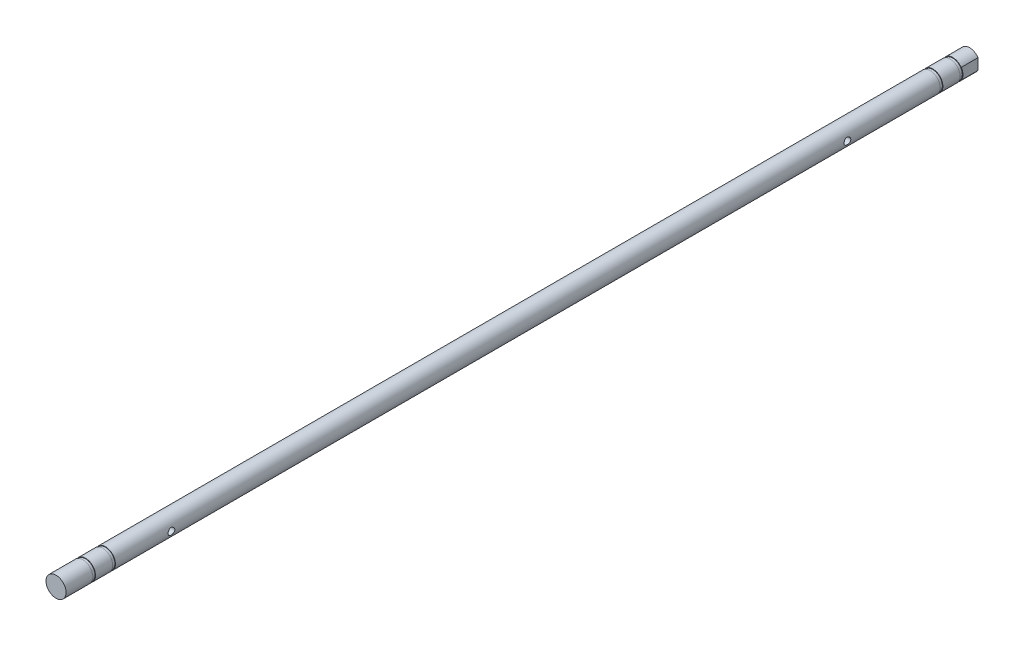
ISO-10303-21;
HEADER;
FILE_DESCRIPTION(('STEP AP214'),'2;1');
FILE_NAME('part.step','',(''),(''),'','','');
FILE_SCHEMA(('AUTOMOTIVE_DESIGN { 1 0 10303 214 1 1 1 1 }'));
ENDSEC;
DATA;
#1=APPLICATION_CONTEXT('core data for automotive mechanical design processes');
#2=APPLICATION_PROTOCOL_DEFINITION('international standard','automotive_design',2000,#1);
#3=PRODUCT_CONTEXT('',#1,'mechanical');
#4=PRODUCT('Part','Part','',(#3));
#5=PRODUCT_RELATED_PRODUCT_CATEGORY('part','',(#4));
#6=PRODUCT_DEFINITION_FORMATION('','',#4);
#7=PRODUCT_DEFINITION_CONTEXT('part definition',#1,'design');
#8=PRODUCT_DEFINITION('design','',#6,#7);
#9=PRODUCT_DEFINITION_SHAPE('','',#8);
#10=(LENGTH_UNIT() NAMED_UNIT(*) SI_UNIT(.MILLI.,.METRE.));
#11=(NAMED_UNIT(*) PLANE_ANGLE_UNIT() SI_UNIT($,.RADIAN.));
#12=(NAMED_UNIT(*) SI_UNIT($,.STERADIAN.) SOLID_ANGLE_UNIT());
#13=UNCERTAINTY_MEASURE_WITH_UNIT(LENGTH_MEASURE(1.E-05),#10,'distance_accuracy_value','');
#14=(GEOMETRIC_REPRESENTATION_CONTEXT(3) GLOBAL_UNCERTAINTY_ASSIGNED_CONTEXT((#13)) GLOBAL_UNIT_ASSIGNED_CONTEXT((#10,
#11,#12)) REPRESENTATION_CONTEXT('',''));
#15=CARTESIAN_POINT('',(0.,0.,0.));
#16=DIRECTION('',(0.,0.,1.));
#17=DIRECTION('',(1.,0.,0.));
#18=AXIS2_PLACEMENT_3D('',#15,#16,#17);
#19=CARTESIAN_POINT('',(-2.5,-3.00000000000001,0.));
#20=DIRECTION('',(1.,0.,0.));
#21=DIRECTION('',(0.,0.,-1.));
#22=AXIS2_PLACEMENT_3D('',#19,#20,#21);
#23=PLANE('',#22);
#24=DIRECTION('',(0.,1.,0.));
#25=VECTOR('',#24,1.);
#26=CARTESIAN_POINT('',(-2.5,-3.00000000000001,2.));
#27=LINE('',#26,#25);
#28=CARTESIAN_POINT('',(-2.49999999999998,-1.65831239517773,2.));
#29=VERTEX_POINT('',#28);
#30=CARTESIAN_POINT('',(-2.5,1.65831239517775,2.));
#31=VERTEX_POINT('',#30);
#32=EDGE_CURVE('E83',#29,#31,#27,.T.);
#33=ORIENTED_EDGE('',*,*,#32,.F.);
#34=DIRECTION('',(0.,0.,-1.));
#35=VECTOR('',#34,1.);
#36=CARTESIAN_POINT('',(-2.49999999999996,-1.65831239517775,275.));
#37=LINE('',#36,#35);
#38=CARTESIAN_POINT('',(-2.5,-1.6583123951777,7.00000000000001));
#39=VERTEX_POINT('',#38);
#40=EDGE_CURVE('E91',#39,#29,#37,.T.);
#41=ORIENTED_EDGE('',*,*,#40,.F.);
#42=DIRECTION('',(0.,1.,0.));
#43=VECTOR('',#42,1.);
#44=CARTESIAN_POINT('',(-2.5,-3.00000000000001,7.));
#45=LINE('',#44,#43);
#46=CARTESIAN_POINT('',(-2.5,1.6583123951777,7.00000000000001));
#47=VERTEX_POINT('',#46);
#48=EDGE_CURVE('E238',#39,#47,#45,.T.);
#49=ORIENTED_EDGE('',*,*,#48,.T.);
#50=DIRECTION('',(0.,0.,-1.));
#51=VECTOR('',#50,1.);
#52=CARTESIAN_POINT('',(-2.49999999999996,1.65831239517775,275.));
#53=LINE('',#52,#51);
#54=EDGE_CURVE('E100',#31,#47,#53,.F.);
#55=ORIENTED_EDGE('',*,*,#54,.F.);
#56=EDGE_LOOP('',(#33,#41,#49,#55));
#57=FACE_BOUND('',#56,.T.);
#58=ADVANCED_FACE('F42',(#57),#23,.F.);
#59=CARTESIAN_POINT('',(2.5,-3.00000000000001,0.));
#60=DIRECTION('',(-1.,0.,0.));
#61=DIRECTION('',(0.,0.,1.));
#62=AXIS2_PLACEMENT_3D('',#59,#60,#61);
#63=PLANE('',#62);
#64=DIRECTION('',(0.,-1.,0.));
#65=VECTOR('',#64,1.);
#66=CARTESIAN_POINT('',(2.5,-3.00000000000001,2.));
#67=LINE('',#66,#65);
#68=CARTESIAN_POINT('',(2.5,1.6583123951777,2.));
#69=VERTEX_POINT('',#68);
#70=CARTESIAN_POINT('',(2.50000000000003,-1.65831239517765,2.));
#71=VERTEX_POINT('',#70);
#72=EDGE_CURVE('E56',#69,#71,#67,.T.);
#73=ORIENTED_EDGE('',*,*,#72,.F.);
#74=DIRECTION('',(0.,0.,-1.));
#75=VECTOR('',#74,1.);
#76=CARTESIAN_POINT('',(2.50000000000003,1.65831239517765,275.));
#77=LINE('',#76,#75);
#78=CARTESIAN_POINT('',(2.5,1.6583123951777,7.00000000000001));
#79=VERTEX_POINT('',#78);
#80=EDGE_CURVE('E115',#79,#69,#77,.T.);
#81=ORIENTED_EDGE('',*,*,#80,.F.);
#82=DIRECTION('',(0.,1.,0.));
#83=VECTOR('',#82,1.);
#84=CARTESIAN_POINT('',(2.5,-3.00000000000001,7.));
#85=LINE('',#84,#83);
#86=CARTESIAN_POINT('',(2.5,-1.6583123951777,7.00000000000001));
#87=VERTEX_POINT('',#86);
#88=EDGE_CURVE('E67',#87,#79,#85,.T.);
#89=ORIENTED_EDGE('',*,*,#88,.F.);
#90=DIRECTION('',(0.,0.,-1.));
#91=VECTOR('',#90,1.);
#92=CARTESIAN_POINT('',(2.50000000000003,-1.65831239517765,275.));
#93=LINE('',#92,#91);
#94=EDGE_CURVE('E108',#71,#87,#93,.F.);
#95=ORIENTED_EDGE('',*,*,#94,.F.);
#96=EDGE_LOOP('',(#73,#81,#89,#95));
#97=FACE_BOUND('',#96,.T.);
#98=ADVANCED_FACE('F161',(#97),#63,.F.);
#99=CARTESIAN_POINT('',(0.,0.,275.));
#100=DIRECTION('',(0.,0.,-1.));
#101=DIRECTION('',(-1.,0.,0.));
#102=AXIS2_PLACEMENT_3D('',#99,#100,#101);
#103=CYLINDRICAL_SURFACE('',#102,3.);
#104=CARTESIAN_POINT('',(0.,0.,7.05000000000006));
#105=DIRECTION('',(0.,0.,1.));
#106=DIRECTION('',(1.,0.,0.));
#107=AXIS2_PLACEMENT_3D('',#104,#105,#106);
#108=CIRCLE('',#107,3.00000000000001);
#109=CARTESIAN_POINT('',(3.00000000000001,0.,7.05000000000006));
#110=VERTEX_POINT('',#109);
#111=EDGE_CURVE('E217',#110,#110,#108,.T.);
#112=ORIENTED_EDGE('',*,*,#111,.F.);
#113=EDGE_LOOP('',(#112));
#114=FACE_BOUND('',#113,.T.);
#115=CARTESIAN_POINT('',(0.,0.,2.));
#116=DIRECTION('',(0.,0.,-1.));
#117=DIRECTION('',(-1.,0.,0.));
#118=AXIS2_PLACEMENT_3D('',#115,#116,#117);
#119=CIRCLE('',#118,3.);
#120=EDGE_CURVE('E12',#31,#69,#119,.T.);
#121=ORIENTED_EDGE('',*,*,#120,.F.);
#122=ORIENTED_EDGE('',*,*,#54,.T.);
#123=CARTESIAN_POINT('',(0.,0.,7.00000000000001));
#124=DIRECTION('',(0.,0.,1.));
#125=DIRECTION('',(1.,0.,0.));
#126=AXIS2_PLACEMENT_3D('',#123,#124,#125);
#127=CIRCLE('',#126,3.);
#128=EDGE_CURVE('E105',#47,#39,#127,.T.);
#129=ORIENTED_EDGE('',*,*,#128,.T.);
#130=ORIENTED_EDGE('',*,*,#40,.T.);
#131=EDGE_CURVE('E47',#71,#29,#119,.T.);
#132=ORIENTED_EDGE('',*,*,#131,.F.);
#133=ORIENTED_EDGE('',*,*,#94,.T.);
#134=CARTESIAN_POINT('',(0.,0.,7.00000000000001));
#135=DIRECTION('',(0.,0.,1.));
#136=DIRECTION('',(1.,0.,0.));
#137=AXIS2_PLACEMENT_3D('',#134,#135,#136);
#138=CIRCLE('',#137,3.);
#139=EDGE_CURVE('E103',#87,#79,#138,.T.);
#140=ORIENTED_EDGE('',*,*,#139,.T.);
#141=ORIENTED_EDGE('',*,*,#80,.T.);
#142=EDGE_LOOP('',(#121,#122,#129,#130,#132,#133,#140,#141));
#143=FACE_BOUND('',#142,.T.);
#144=ADVANCED_FACE('F97',(#114,#143),#103,.T.);
#145=CARTESIAN_POINT('',(0.,3.,260.25));
#146=DIRECTION('',(0.,0.,1.));
#147=DIRECTION('',(1.,0.,0.));
#148=AXIS2_PLACEMENT_3D('',#145,#146,#147);
#149=PLANE('',#148);
#150=CARTESIAN_POINT('',(0.,0.,260.25));
#151=DIRECTION('',(0.,0.,1.));
#152=DIRECTION('',(1.,0.,0.));
#153=AXIS2_PLACEMENT_3D('',#150,#151,#152);
#154=CIRCLE('',#153,2.85);
#155=CARTESIAN_POINT('',(2.85,0.,260.25));
#156=VERTEX_POINT('',#155);
#157=EDGE_CURVE('E255',#156,#156,#154,.T.);
#158=ORIENTED_EDGE('',*,*,#157,.F.);
#159=EDGE_LOOP('',(#158));
#160=FACE_BOUND('',#159,.T.);
#161=CARTESIAN_POINT('',(0.,0.,260.25));
#162=DIRECTION('',(0.,0.,1.));
#163=DIRECTION('',(1.,0.,0.));
#164=AXIS2_PLACEMENT_3D('',#161,#162,#163);
#165=CIRCLE('',#164,3.);
#166=CARTESIAN_POINT('',(3.,0.,260.25));
#167=VERTEX_POINT('',#166);
#168=EDGE_CURVE('E229',#167,#167,#165,.T.);
#169=ORIENTED_EDGE('',*,*,#168,.T.);
#170=EDGE_LOOP('',(#169));
#171=FACE_BOUND('',#170,.T.);
#172=ADVANCED_FACE('F183',(#160,#171),#149,.T.);
#173=CARTESIAN_POINT('',(-3.,0.,40.5));
#174=CARTESIAN_POINT('',(-3.00000015300943,0.0545633628867235,40.4999997462684));
#175=CARTESIAN_POINT('',(-2.99849769507544,0.10912519453855,40.5044802661272));
#176=CARTESIAN_POINT('',(-2.99265210203281,0.216641760872973,40.5222291088172));
#177=CARTESIAN_POINT('',(-2.98830867202152,0.269596328118819,40.5354983439489));
#178=CARTESIAN_POINT('',(-2.97725307906442,0.372332789501777,40.570319243384));
#179=CARTESIAN_POINT('',(-2.97054487730853,0.422119825886035,40.5918570624593));
#180=CARTESIAN_POINT('',(-2.95544445717342,0.517374936805325,40.6425411728383));
#181=CARTESIAN_POINT('',(-2.94705190667778,0.562842156958706,40.6716889650026));
#182=CARTESIAN_POINT('',(-2.92914094443005,0.649741675022265,40.7378258048588));
#183=CARTESIAN_POINT('',(-2.91959556463785,0.691003700298307,40.7750312342605));
#184=CARTESIAN_POINT('',(-2.90060314783121,0.766832692702082,40.8557671547066));
#185=CARTESIAN_POINT('',(-2.89115613290549,0.801398185489461,40.8992990349285));
#186=CARTESIAN_POINT('',(-2.87313332477274,0.86382494222786,40.9929851151965));
#187=CARTESIAN_POINT('',(-2.86459039275688,0.891464858221034,41.0432937397321));
#188=CARTESIAN_POINT('',(-2.84975305418601,0.937818873877724,41.1481760944586));
#189=CARTESIAN_POINT('',(-2.84345796160745,0.956535697386767,41.2027485171628));
#190=CARTESIAN_POINT('',(-2.83411303269377,0.983873461509166,41.3126732214967));
#191=CARTESIAN_POINT('',(-2.83096095769611,0.992813448271771,41.3679372084891));
#192=CARTESIAN_POINT('',(-2.82795656629507,1.00134112333448,41.4792637541559));
#193=CARTESIAN_POINT('',(-2.8281032302273,1.00093170160472,41.5353260607092));
#194=CARTESIAN_POINT('',(-2.8315901500818,0.991019903703419,41.643936630444));
#195=CARTESIAN_POINT('',(-2.83478415867533,0.981933913166995,41.696528402919));
#196=CARTESIAN_POINT('',(-2.84376657724551,0.955606162849417,41.7993934196068));
#197=CARTESIAN_POINT('',(-2.84955529784107,0.938363426591871,41.8496663854351));
#198=CARTESIAN_POINT('',(-2.86317911131249,0.895939058060213,41.9474127495915));
#199=CARTESIAN_POINT('',(-2.87104565793117,0.870634048707265,41.9948280254695));
#200=CARTESIAN_POINT('',(-2.88792558575726,0.81288910630314,42.0848709082797));
#201=CARTESIAN_POINT('',(-2.89693929790463,0.780447112364006,42.1274971269334));
#202=CARTESIAN_POINT('',(-2.91567329167741,0.707349332682237,42.2090915981608));
#203=CARTESIAN_POINT('',(-2.92540589354843,0.666353150076311,42.2477526945091));
#204=CARTESIAN_POINT('',(-2.94406938387037,0.578339569970064,42.3177312666634));
#205=CARTESIAN_POINT('',(-2.95300019538067,0.531321595660813,42.3490480381645));
#206=CARTESIAN_POINT('',(-2.96917107937794,0.431947613046267,42.4036963002351));
#207=CARTESIAN_POINT('',(-2.97639350008039,0.379543276416336,42.4269454913407));
#208=CARTESIAN_POINT('',(-2.98820567144435,0.271269083364508,42.4642031739557));
#209=CARTESIAN_POINT('',(-2.99279633654878,0.215400438154954,42.4782148754234));
#210=CARTESIAN_POINT('',(-2.99867627071441,0.104383829529303,42.4960556660224));
#211=CARTESIAN_POINT('',(-3.00010001833731,0.0493095998648447,42.5002998091728));
#212=CARTESIAN_POINT('',(-2.99988902694825,-0.0607750699602373,42.4996673264015));
#213=CARTESIAN_POINT('',(-2.99825480419352,-0.115785519319648,42.4947922400201));
#214=CARTESIAN_POINT('',(-2.99220024717114,-0.22251986630426,42.476388092264));
#215=CARTESIAN_POINT('',(-2.98786198711228,-0.274292806834858,42.4631137939505));
#216=CARTESIAN_POINT('',(-2.97691846830034,-0.374855958579563,42.4286065555333));
#217=CARTESIAN_POINT('',(-2.97031292046541,-0.423645788508561,42.4073726005323));
#218=CARTESIAN_POINT('',(-2.95528931287427,-0.518288296393323,42.3569295681591));
#219=CARTESIAN_POINT('',(-2.94682814756305,-0.564029959217331,42.3275254067164));
#220=CARTESIAN_POINT('',(-2.92905253915743,-0.650064830135405,42.2618058499869));
#221=CARTESIAN_POINT('',(-2.91973783591888,-0.690356367794895,42.2254883439698));
#222=CARTESIAN_POINT('',(-2.90076847982472,-0.766252507807012,42.1450212489917));
#223=CARTESIAN_POINT('',(-2.89111761095155,-0.801560969248489,42.1005907730668));
#224=CARTESIAN_POINT('',(-2.87299973286981,-0.864257522320852,42.0062284321955));
#225=CARTESIAN_POINT('',(-2.8645327335312,-0.891645547920843,41.9562965213898));
#226=CARTESIAN_POINT('',(-2.84982391820308,-0.93759693042336,41.8523269846934));
#227=CARTESIAN_POINT('',(-2.84357760900632,-0.956178132197764,41.7982979207572));
#228=CARTESIAN_POINT('',(-2.83410832399133,-0.983894666792162,41.6876213498759));
#229=CARTESIAN_POINT('',(-2.83088398622698,-0.993034254961244,41.6309750345669));
#230=CARTESIAN_POINT('',(-2.82797858875071,-1.00127628247038,41.5198029039868));
#231=CARTESIAN_POINT('',(-2.82812400344299,-1.00087025731093,41.4653176597483));
#232=CARTESIAN_POINT('',(-2.8315126992356,-0.991242293454878,41.3572349251003));
#233=CARTESIAN_POINT('',(-2.83475579595884,-0.982020879458888,41.3036373820471));
#234=CARTESIAN_POINT('',(-2.84384524278943,-0.955371813126982,41.1998643369873));
#235=CARTESIAN_POINT('',(-2.84964098015514,-0.938103346014881,41.1496431749928));
#236=CARTESIAN_POINT('',(-2.86316398825433,-0.895979365760381,41.0527725930645));
#237=CARTESIAN_POINT('',(-2.87089168765297,-0.871122168553976,41.0061239688127));
#238=CARTESIAN_POINT('',(-2.8878282922406,-0.813260692583244,40.9155163300763));
#239=CARTESIAN_POINT('',(-2.89708711641604,-0.779948242764528,40.8717634981014));
#240=CARTESIAN_POINT('',(-2.91583356283786,-0.706642883135694,40.790310186616));
#241=CARTESIAN_POINT('',(-2.92532124912518,-0.666648084451491,40.752611424312));
#242=CARTESIAN_POINT('',(-2.94390030525393,-0.579241556920672,40.6828555877108));
#243=CARTESIAN_POINT('',(-2.95296181801216,-0.531601513499724,40.651075652249));
#244=CARTESIAN_POINT('',(-2.96925991172652,-0.431357357406628,40.5960095711494));
#245=CARTESIAN_POINT('',(-2.9764969590794,-0.378754518132349,40.572721254078));
#246=CARTESIAN_POINT('',(-2.98805515068532,-0.272493647200975,40.5362783675113));
#247=CARTESIAN_POINT('',(-2.9924921242252,-0.218987757676408,40.5227175337366));
#248=CARTESIAN_POINT('',(-2.99846407064224,-0.110320416010247,40.5045797193229));
#249=CARTESIAN_POINT('',(-2.99999984531906,-0.0551594255687466,40.5000002565035));
#250=CARTESIAN_POINT('',(-3.,0.,40.5));
#251=B_SPLINE_CURVE_WITH_KNOTS('',3,(#173,#174,#175,#176,#177,#178,#179,#180,#181,#182,#183,
#184,#185,#186,#187,#188,#189,#190,#191,#192,#193,#194,#195,#196,#197,#198,#199,#200,#201,#202,
#203,#204,#205,#206,#207,#208,#209,#210,#211,#212,#213,#214,#215,#216,#217,#218,#219,#220,#221,
#222,#223,#224,#225,#226,#227,#228,#229,#230,#231,#232,#233,#234,#235,#236,#237,#238,#239,#240,
#241,#242,#243,#244,#245,#246,#247,#248,#249,#250),.UNSPECIFIED.,.T.,.F.,(4,2,2,2,2,2,2,2,2,2,2,
2,2,2,2,2,2,2,2,2,2,2,2,2,2,2,2,2,2,2,2,2,2,2,2,2,2,2,4),(0.,0.163487106026012,
0.326991185267521,0.490222672870274,0.653486377799099,0.821846842827557,0.990244332875301,
1.16348384823471,1.33667044692834,1.50401925741841,1.67131633987486,1.83096826551281,
1.99063930855482,2.15288171155131,2.31517102558208,2.48593305811367,2.65671145966619,
2.82918405650358,3.00159668877209,3.1665358317517,3.33144713164177,3.49158157978214,
3.65173645284104,3.81610399843737,3.98052180821892,4.15241022880751,4.32430008234997,
4.49584013824416,4.66730284700846,4.82995666056619,4.99260079341185,5.15215587070228,
5.31174638165789,5.47830066681616,5.64490211113589,5.81799660824911,5.99104681142267,
6.15636558363624,6.3216386602795),.UNSPECIFIED.);
#252=CARTESIAN_POINT('',(-3.,0.,40.5));
#253=VERTEX_POINT('',#252);
#254=EDGE_CURVE('E86',#253,#253,#251,.T.);
#255=ORIENTED_EDGE('',*,*,#254,.T.);
#256=EDGE_LOOP('',(#255));
#257=FACE_BOUND('',#256,.T.);
#258=CARTESIAN_POINT('',(3.00000000000001,0.,40.5));
#259=CARTESIAN_POINT('',(3.00000015300944,-0.0545633628867233,40.4999997462684));
#260=CARTESIAN_POINT('',(2.99849769507545,-0.10912519453855,40.5044802661272));
#261=CARTESIAN_POINT('',(2.99265210203281,-0.216641760872973,40.5222291088172));
#262=CARTESIAN_POINT('',(2.98830867202152,-0.269596328118819,40.5354983439489));
#263=CARTESIAN_POINT('',(2.97725307906443,-0.372332789501777,40.570319243384));
#264=CARTESIAN_POINT('',(2.97054487730853,-0.422119825886035,40.5918570624593));
#265=CARTESIAN_POINT('',(2.95544445717342,-0.517374936805325,40.6425411728383));
#266=CARTESIAN_POINT('',(2.94705190667778,-0.562842156958706,40.6716889650026));
#267=CARTESIAN_POINT('',(2.92914094443005,-0.649741675022265,40.7378258048588));
#268=CARTESIAN_POINT('',(2.91959556463785,-0.691003700298307,40.7750312342605));
#269=CARTESIAN_POINT('',(2.90060314783121,-0.766832692702081,40.8557671547066));
#270=CARTESIAN_POINT('',(2.89115613290549,-0.801398185489461,40.8992990349285));
#271=CARTESIAN_POINT('',(2.87313332477274,-0.863824942227859,40.9929851151965));
#272=CARTESIAN_POINT('',(2.86459039275688,-0.891464858221032,41.0432937397321));
#273=CARTESIAN_POINT('',(2.84975305418601,-0.937818873877721,41.1481760944585));
#274=CARTESIAN_POINT('',(2.84345796160745,-0.956535697386765,41.2027485171627));
#275=CARTESIAN_POINT('',(2.83411303269377,-0.983873461509165,41.3126732214967));
#276=CARTESIAN_POINT('',(2.83096095769611,-0.992813448271771,41.3679372084891));
#277=CARTESIAN_POINT('',(2.82795656629507,-1.00134112333448,41.4792637541559));
#278=CARTESIAN_POINT('',(2.8281032302273,-1.00093170160472,41.5353260607092));
#279=CARTESIAN_POINT('',(2.8315901500818,-0.991019903703419,41.643936630444));
#280=CARTESIAN_POINT('',(2.83478415867533,-0.981933913166995,41.696528402919));
#281=CARTESIAN_POINT('',(2.84376657724551,-0.955606162849417,41.7993934196068));
#282=CARTESIAN_POINT('',(2.84955529784108,-0.938363426591871,41.8496663854351));
#283=CARTESIAN_POINT('',(2.86317911131249,-0.895939058060213,41.9474127495915));
#284=CARTESIAN_POINT('',(2.87104565793117,-0.870634048707265,41.9948280254695));
#285=CARTESIAN_POINT('',(2.88792558575726,-0.81288910630314,42.0848709082797));
#286=CARTESIAN_POINT('',(2.89693929790463,-0.780447112364006,42.1274971269334));
#287=CARTESIAN_POINT('',(2.91567329167741,-0.707349332682237,42.2090915981608));
#288=CARTESIAN_POINT('',(2.92540589354843,-0.666353150076311,42.2477526945091));
#289=CARTESIAN_POINT('',(2.94406938387037,-0.578339569970064,42.3177312666634));
#290=CARTESIAN_POINT('',(2.95300019538067,-0.531321595660813,42.3490480381645));
#291=CARTESIAN_POINT('',(2.96917107937794,-0.431947613046267,42.4036963002351));
#292=CARTESIAN_POINT('',(2.97639350008039,-0.379543276416337,42.4269454913407));
#293=CARTESIAN_POINT('',(2.98820567144435,-0.271269083364509,42.4642031739557));
#294=CARTESIAN_POINT('',(2.99279633654878,-0.215400438154955,42.4782148754234));
#295=CARTESIAN_POINT('',(2.99867627071441,-0.104383829529304,42.4960556660224));
#296=CARTESIAN_POINT('',(3.00010001833731,-0.0493095998648454,42.5002998091728));
#297=CARTESIAN_POINT('',(2.99988902694825,0.0607750699602364,42.4996673264015));
#298=CARTESIAN_POINT('',(2.99825480419352,0.115785519319647,42.4947922400201));
#299=CARTESIAN_POINT('',(2.99220024717114,0.222519866304259,42.476388092264));
#300=CARTESIAN_POINT('',(2.98786198711228,0.274292806834857,42.4631137939505));
#301=CARTESIAN_POINT('',(2.97691846830034,0.374855958579562,42.4286065555333));
#302=CARTESIAN_POINT('',(2.97031292046541,0.42364578850856,42.4073726005323));
#303=CARTESIAN_POINT('',(2.95528931287427,0.518288296393323,42.3569295681591));
#304=CARTESIAN_POINT('',(2.94682814756305,0.564029959217331,42.3275254067164));
#305=CARTESIAN_POINT('',(2.92905253915743,0.650064830135405,42.2618058499869));
#306=CARTESIAN_POINT('',(2.91973783591888,0.690356367794895,42.2254883439698));
#307=CARTESIAN_POINT('',(2.90076847982472,0.766252507807013,42.1450212489917));
#308=CARTESIAN_POINT('',(2.89111761095155,0.801560969248491,42.1005907730668));
#309=CARTESIAN_POINT('',(2.87299973286981,0.864257522320852,42.0062284321955));
#310=CARTESIAN_POINT('',(2.8645327335312,0.891645547920841,41.9562965213898));
#311=CARTESIAN_POINT('',(2.84982391820308,0.937596930423359,41.8523269846934));
#312=CARTESIAN_POINT('',(2.84357760900632,0.956178132197765,41.7982979207572));
#313=CARTESIAN_POINT('',(2.83410832399133,0.983894666792163,41.6876213498759));
#314=CARTESIAN_POINT('',(2.83088398622698,0.993034254961244,41.6309750345669));
#315=CARTESIAN_POINT('',(2.82797858875071,1.00127628247038,41.5198029039868));
#316=CARTESIAN_POINT('',(2.82812400344299,1.00087025731093,41.4653176597483));
#317=CARTESIAN_POINT('',(2.8315126992356,0.991242293454879,41.3572349251003));
#318=CARTESIAN_POINT('',(2.83475579595884,0.982020879458888,41.3036373820471));
#319=CARTESIAN_POINT('',(2.84384524278943,0.955371813126982,41.1998643369873));
#320=CARTESIAN_POINT('',(2.84964098015514,0.938103346014881,41.1496431749928));
#321=CARTESIAN_POINT('',(2.86316398825433,0.895979365760381,41.0527725930645));
#322=CARTESIAN_POINT('',(2.87089168765297,0.871122168553976,41.0061239688127));
#323=CARTESIAN_POINT('',(2.8878282922406,0.813260692583244,40.9155163300763));
#324=CARTESIAN_POINT('',(2.89708711641604,0.779948242764528,40.8717634981014));
#325=CARTESIAN_POINT('',(2.91583356283786,0.706642883135694,40.790310186616));
#326=CARTESIAN_POINT('',(2.92532124912518,0.666648084451491,40.752611424312));
#327=CARTESIAN_POINT('',(2.94390030525393,0.579241556920672,40.6828555877108));
#328=CARTESIAN_POINT('',(2.95296181801216,0.531601513499724,40.651075652249));
#329=CARTESIAN_POINT('',(2.96925991172652,0.431357357406628,40.5960095711494));
#330=CARTESIAN_POINT('',(2.9764969590794,0.378754518132349,40.572721254078));
#331=CARTESIAN_POINT('',(2.98805515068532,0.272493647200975,40.5362783675113));
#332=CARTESIAN_POINT('',(2.9924921242252,0.218987757676408,40.5227175337366));
#333=CARTESIAN_POINT('',(2.99846407064225,0.110320416010247,40.5045797193229));
#334=CARTESIAN_POINT('',(2.99999984531907,0.0551594255687466,40.5000002565035));
#335=CARTESIAN_POINT('',(3.00000000000001,0.,40.5));
#336=B_SPLINE_CURVE_WITH_KNOTS('',3,(#258,#259,#260,#261,#262,#263,#264,#265,#266,#267,#268,
#269,#270,#271,#272,#273,#274,#275,#276,#277,#278,#279,#280,#281,#282,#283,#284,#285,#286,#287,
#288,#289,#290,#291,#292,#293,#294,#295,#296,#297,#298,#299,#300,#301,#302,#303,#304,#305,#306,
#307,#308,#309,#310,#311,#312,#313,#314,#315,#316,#317,#318,#319,#320,#321,#322,#323,#324,#325,
#326,#327,#328,#329,#330,#331,#332,#333,#334,#335),.UNSPECIFIED.,.T.,.F.,(4,2,2,2,2,2,2,2,2,2,2,
2,2,2,2,2,2,2,2,2,2,2,2,2,2,2,2,2,2,2,2,2,2,2,2,2,2,2,4),(0.,0.163487106026012,
0.326991185267521,0.490222672870274,0.653486377799099,0.821846842827557,0.990244332875301,
1.16348384823471,1.33667044692833,1.50401925741841,1.67131633987486,1.83096826551281,
1.99063930855482,2.15288171155131,2.31517102558208,2.48593305811368,2.65671145966619,
2.82918405650358,3.00159668877209,3.1665358317517,3.33144713164177,3.49158157978214,
3.65173645284104,3.81610399843737,3.98052180821892,4.15241022880752,4.32430008234996,
4.49584013824416,4.66730284700846,4.82995666056618,4.99260079341185,5.15215587070228,
5.31174638165789,5.47830066681616,5.64490211113589,5.81799660824911,5.99104681142267,
6.15636558363624,6.3216386602795),.UNSPECIFIED.);
#337=CARTESIAN_POINT('',(3.00000000000001,0.,40.5));
#338=VERTEX_POINT('',#337);
#339=EDGE_CURVE('E437',#338,#338,#336,.T.);
#340=ORIENTED_EDGE('',*,*,#339,.T.);
#341=EDGE_LOOP('',(#340));
#342=FACE_BOUND('',#341,.T.);
#343=CARTESIAN_POINT('',(-3.,0.,242.5));
#344=CARTESIAN_POINT('',(-3.00000015300943,0.0545633628867224,242.499999746268));
#345=CARTESIAN_POINT('',(-2.99849769507545,0.109125194538547,242.504480266127));
#346=CARTESIAN_POINT('',(-2.99265210203281,0.216641760872972,242.522229108817));
#347=CARTESIAN_POINT('',(-2.98830867202152,0.269596328118821,242.535498343949));
#348=CARTESIAN_POINT('',(-2.97725307906442,0.372332789501783,242.570319243384));
#349=CARTESIAN_POINT('',(-2.97054487730853,0.422119825886041,242.591857062459));
#350=CARTESIAN_POINT('',(-2.95544445717342,0.517374936805331,242.642541172838));
#351=CARTESIAN_POINT('',(-2.94705190667778,0.562842156958712,242.671688965003));
#352=CARTESIAN_POINT('',(-2.92914094443005,0.649741675022273,242.737825804859));
#353=CARTESIAN_POINT('',(-2.91959556463785,0.691003700298315,242.77503123426));
#354=CARTESIAN_POINT('',(-2.90060314783121,0.766832692702086,242.855767154707));
#355=CARTESIAN_POINT('',(-2.89115613290549,0.801398185489464,242.899299034929));
#356=CARTESIAN_POINT('',(-2.87313332477274,0.863824942227856,242.992985115196));
#357=CARTESIAN_POINT('',(-2.86459039275688,0.891464858221025,243.043293739732));
#358=CARTESIAN_POINT('',(-2.84975305418601,0.937818873877714,243.148176094459));
#359=CARTESIAN_POINT('',(-2.84345796160746,0.956535697386761,243.202748517163));
#360=CARTESIAN_POINT('',(-2.83411303269377,0.983873461509164,243.312673221497));
#361=CARTESIAN_POINT('',(-2.83096095769611,0.99281344827177,243.367937208489));
#362=CARTESIAN_POINT('',(-2.82795656629507,1.00134112333448,243.479263754156));
#363=CARTESIAN_POINT('',(-2.8281032302273,1.00093170160472,243.535326060709));
#364=CARTESIAN_POINT('',(-2.8315901500818,0.991019903703419,243.643936630444));
#365=CARTESIAN_POINT('',(-2.83478415867533,0.981933913166996,243.696528402919));
#366=CARTESIAN_POINT('',(-2.84376657724551,0.95560616284942,243.799393419607));
#367=CARTESIAN_POINT('',(-2.84955529784107,0.938363426591874,243.849666385435));
#368=CARTESIAN_POINT('',(-2.86317911131249,0.895939058060212,243.947412749591));
#369=CARTESIAN_POINT('',(-2.87104565793117,0.870634048707262,243.99482802547));
#370=CARTESIAN_POINT('',(-2.88792558575726,0.812889106303136,244.08487090828));
#371=CARTESIAN_POINT('',(-2.89693929790464,0.780447112364002,244.127497126933));
#372=CARTESIAN_POINT('',(-2.91567329167741,0.707349332682224,244.209091598161));
#373=CARTESIAN_POINT('',(-2.92540589354843,0.666353150076288,244.247752694509));
#374=CARTESIAN_POINT('',(-2.94406938387037,0.578339569970039,244.317731266663));
#375=CARTESIAN_POINT('',(-2.95300019538068,0.5313215956608,244.349048038165));
#376=CARTESIAN_POINT('',(-2.96917107937794,0.431947613046263,244.403696300235));
#377=CARTESIAN_POINT('',(-2.97639350008039,0.379543276416331,244.426945491341));
#378=CARTESIAN_POINT('',(-2.98820567144435,0.2712690833645,244.464203173956));
#379=CARTESIAN_POINT('',(-2.99279633654878,0.215400438154947,244.478214875423));
#380=CARTESIAN_POINT('',(-2.99867627071441,0.104383829529297,244.496055666022));
#381=CARTESIAN_POINT('',(-3.00010001833731,0.0493095998648393,244.500299809173));
#382=CARTESIAN_POINT('',(-2.99988902694825,-0.0607750699602422,244.499667326402));
#383=CARTESIAN_POINT('',(-2.99825480419352,-0.115785519319653,244.49479224002));
#384=CARTESIAN_POINT('',(-2.99220024717114,-0.222519866304265,244.476388092264));
#385=CARTESIAN_POINT('',(-2.98786198711228,-0.274292806834862,244.46311379395));
#386=CARTESIAN_POINT('',(-2.97691846830034,-0.374855958579563,244.428606555533));
#387=CARTESIAN_POINT('',(-2.97031292046541,-0.423645788508558,244.407372600532));
#388=CARTESIAN_POINT('',(-2.95528931287427,-0.518288296393321,244.356929568159));
#389=CARTESIAN_POINT('',(-2.94682814756305,-0.564029959217334,244.327525406716));
#390=CARTESIAN_POINT('',(-2.92905253915743,-0.650064830135408,244.261805849987));
#391=CARTESIAN_POINT('',(-2.91973783591888,-0.690356367794892,244.22548834397));
#392=CARTESIAN_POINT('',(-2.90076847982472,-0.766252507807004,244.145021248992));
#393=CARTESIAN_POINT('',(-2.89111761095156,-0.801560969248482,244.100590773067));
#394=CARTESIAN_POINT('',(-2.87299973286981,-0.86425752232085,244.006228432196));
#395=CARTESIAN_POINT('',(-2.8645327335312,-0.891645547920841,243.95629652139));
#396=CARTESIAN_POINT('',(-2.84982391820308,-0.937596930423355,243.852326984693));
#397=CARTESIAN_POINT('',(-2.84357760900632,-0.95617813219776,243.798297920757));
#398=CARTESIAN_POINT('',(-2.83410832399133,-0.983894666792161,243.687621349876));
#399=CARTESIAN_POINT('',(-2.83088398622698,-0.993034254961243,243.630975034567));
#400=CARTESIAN_POINT('',(-2.82797858875071,-1.00127628247038,243.519802903987));
#401=CARTESIAN_POINT('',(-2.82812400344299,-1.00087025731093,243.465317659748));
#402=CARTESIAN_POINT('',(-2.8315126992356,-0.99124229345488,243.3572349251));
#403=CARTESIAN_POINT('',(-2.83475579595884,-0.982020879458889,243.303637382047));
#404=CARTESIAN_POINT('',(-2.84384524278943,-0.955371813126978,243.199864336987));
#405=CARTESIAN_POINT('',(-2.84964098015514,-0.938103346014876,243.149643174993));
#406=CARTESIAN_POINT('',(-2.86316398825433,-0.895979365760381,243.052772593064));
#407=CARTESIAN_POINT('',(-2.87089168765296,-0.871122168553982,243.006123968813));
#408=CARTESIAN_POINT('',(-2.8878282922406,-0.813260692583252,242.915516330076));
#409=CARTESIAN_POINT('',(-2.89708711641604,-0.779948242764532,242.871763498101));
#410=CARTESIAN_POINT('',(-2.91583356283786,-0.706642883135694,242.790310186616));
#411=CARTESIAN_POINT('',(-2.92532124912518,-0.66664808445149,242.752611424312));
#412=CARTESIAN_POINT('',(-2.94390030525393,-0.579241556920671,242.682855587711));
#413=CARTESIAN_POINT('',(-2.95296181801216,-0.531601513499727,242.651075652249));
#414=CARTESIAN_POINT('',(-2.96925991172652,-0.43135735740663,242.596009571149));
#415=CARTESIAN_POINT('',(-2.9764969590794,-0.378754518132346,242.572721254078));
#416=CARTESIAN_POINT('',(-2.98805515068532,-0.272493647200968,242.536278367511));
#417=CARTESIAN_POINT('',(-2.9924921242252,-0.218987757676403,242.522717533737));
#418=CARTESIAN_POINT('',(-2.99846407064224,-0.110320416010244,242.504579719323));
#419=CARTESIAN_POINT('',(-2.99999984531906,-0.0551594255687447,242.500000256503));
#420=CARTESIAN_POINT('',(-3.,0.,242.5));
#421=B_SPLINE_CURVE_WITH_KNOTS('',3,(#343,#344,#345,#346,#347,#348,#349,#350,#351,#352,#353,
#354,#355,#356,#357,#358,#359,#360,#361,#362,#363,#364,#365,#366,#367,#368,#369,#370,#371,#372,
#373,#374,#375,#376,#377,#378,#379,#380,#381,#382,#383,#384,#385,#386,#387,#388,#389,#390,#391,
#392,#393,#394,#395,#396,#397,#398,#399,#400,#401,#402,#403,#404,#405,#406,#407,#408,#409,#410,
#411,#412,#413,#414,#415,#416,#417,#418,#419,#420),.UNSPECIFIED.,.T.,.F.,(4,2,2,2,2,2,2,2,2,2,2,
2,2,2,2,2,2,2,2,2,2,2,2,2,2,2,2,2,2,2,2,2,2,2,2,2,2,2,4),(0.,0.16348710602601,0.32699118526752,
0.490222672870289,0.653486377799102,0.821846842827568,0.990244332875289,1.16348384823468,
1.33667044692831,1.5040192574184,1.67131633987487,1.8309682655128,1.99063930855481,
2.1528817115513,2.31517102558209,2.48593305811372,2.6567114596662,2.8291840565036,
3.00159668877209,3.16653583175171,3.33144713164178,3.49158157978215,3.65173645284105,
3.81610399843737,3.98052180821893,4.15241022880749,4.32430008234998,4.49584013824413,
4.66730284700845,4.82995666056619,4.99260079341187,5.15215587070228,5.31174638165789,
5.47830066681616,5.64490211113592,5.81799660824911,5.99104681142268,6.15636558363625,
6.32163866027951),.UNSPECIFIED.);
#422=CARTESIAN_POINT('',(-3.,0.,242.5));
#423=VERTEX_POINT('',#422);
#424=EDGE_CURVE('E125',#423,#423,#421,.T.);
#425=ORIENTED_EDGE('',*,*,#424,.T.);
#426=EDGE_LOOP('',(#425));
#427=FACE_BOUND('',#426,.T.);
#428=CARTESIAN_POINT('',(3.00000000000001,0.,242.5));
#429=CARTESIAN_POINT('',(3.00000015300944,-0.0545633628867221,242.499999746268));
#430=CARTESIAN_POINT('',(2.99849769507545,-0.109125194538547,242.504480266127));
#431=CARTESIAN_POINT('',(2.99265210203281,-0.216641760872971,242.522229108817));
#432=CARTESIAN_POINT('',(2.98830867202152,-0.269596328118821,242.535498343949));
#433=CARTESIAN_POINT('',(2.97725307906442,-0.372332789501783,242.570319243384));
#434=CARTESIAN_POINT('',(2.97054487730853,-0.422119825886041,242.591857062459));
#435=CARTESIAN_POINT('',(2.95544445717342,-0.517374936805331,242.642541172838));
#436=CARTESIAN_POINT('',(2.94705190667778,-0.562842156958712,242.671688965003));
#437=CARTESIAN_POINT('',(2.92914094443005,-0.649741675022273,242.737825804859));
#438=CARTESIAN_POINT('',(2.91959556463785,-0.691003700298315,242.77503123426));
#439=CARTESIAN_POINT('',(2.90060314783121,-0.766832692702086,242.855767154707));
#440=CARTESIAN_POINT('',(2.89115613290549,-0.801398185489464,242.899299034929));
#441=CARTESIAN_POINT('',(2.87313332477274,-0.863824942227856,242.992985115196));
#442=CARTESIAN_POINT('',(2.86459039275688,-0.891464858221025,243.043293739732));
#443=CARTESIAN_POINT('',(2.84975305418601,-0.937818873877714,243.148176094459));
#444=CARTESIAN_POINT('',(2.84345796160746,-0.95653569738676,243.202748517163));
#445=CARTESIAN_POINT('',(2.83411303269377,-0.983873461509163,243.312673221497));
#446=CARTESIAN_POINT('',(2.83096095769611,-0.99281344827177,243.367937208489));
#447=CARTESIAN_POINT('',(2.82795656629507,-1.00134112333448,243.479263754156));
#448=CARTESIAN_POINT('',(2.8281032302273,-1.00093170160472,243.535326060709));
#449=CARTESIAN_POINT('',(2.8315901500818,-0.991019903703419,243.643936630444));
#450=CARTESIAN_POINT('',(2.83478415867533,-0.981933913166996,243.696528402919));
#451=CARTESIAN_POINT('',(2.84376657724551,-0.95560616284942,243.799393419607));
#452=CARTESIAN_POINT('',(2.84955529784107,-0.938363426591874,243.849666385435));
#453=CARTESIAN_POINT('',(2.86317911131249,-0.895939058060212,243.947412749591));
#454=CARTESIAN_POINT('',(2.87104565793117,-0.870634048707262,243.99482802547));
#455=CARTESIAN_POINT('',(2.88792558575726,-0.812889106303136,244.08487090828));
#456=CARTESIAN_POINT('',(2.89693929790464,-0.780447112364002,244.127497126933));
#457=CARTESIAN_POINT('',(2.91567329167741,-0.707349332682224,244.209091598161));
#458=CARTESIAN_POINT('',(2.92540589354843,-0.666353150076288,244.247752694509));
#459=CARTESIAN_POINT('',(2.94406938387037,-0.578339569970039,244.317731266663));
#460=CARTESIAN_POINT('',(2.95300019538068,-0.5313215956608,244.349048038165));
#461=CARTESIAN_POINT('',(2.96917107937794,-0.431947613046263,244.403696300235));
#462=CARTESIAN_POINT('',(2.97639350008039,-0.379543276416331,244.426945491341));
#463=CARTESIAN_POINT('',(2.98820567144435,-0.2712690833645,244.464203173956));
#464=CARTESIAN_POINT('',(2.99279633654878,-0.215400438154947,244.478214875423));
#465=CARTESIAN_POINT('',(2.99867627071441,-0.104383829529298,244.496055666022));
#466=CARTESIAN_POINT('',(3.00010001833731,-0.0493095998648396,244.500299809173));
#467=CARTESIAN_POINT('',(2.99988902694825,0.0607750699602419,244.499667326402));
#468=CARTESIAN_POINT('',(2.99825480419352,0.115785519319652,244.49479224002));
#469=CARTESIAN_POINT('',(2.99220024717114,0.222519866304264,244.476388092264));
#470=CARTESIAN_POINT('',(2.98786198711228,0.274292806834861,244.46311379395));
#471=CARTESIAN_POINT('',(2.97691846830034,0.374855958579563,244.428606555533));
#472=CARTESIAN_POINT('',(2.97031292046541,0.423645788508558,244.407372600532));
#473=CARTESIAN_POINT('',(2.95528931287427,0.518288296393321,244.356929568159));
#474=CARTESIAN_POINT('',(2.94682814756305,0.564029959217334,244.327525406716));
#475=CARTESIAN_POINT('',(2.92905253915743,0.650064830135407,244.261805849987));
#476=CARTESIAN_POINT('',(2.91973783591888,0.690356367794892,244.22548834397));
#477=CARTESIAN_POINT('',(2.90076847982472,0.766252507807004,244.145021248992));
#478=CARTESIAN_POINT('',(2.89111761095156,0.801560969248482,244.100590773067));
#479=CARTESIAN_POINT('',(2.87299973286981,0.86425752232085,244.006228432196));
#480=CARTESIAN_POINT('',(2.8645327335312,0.891645547920841,243.95629652139));
#481=CARTESIAN_POINT('',(2.84982391820308,0.937596930423355,243.852326984693));
#482=CARTESIAN_POINT('',(2.84357760900632,0.95617813219776,243.798297920757));
#483=CARTESIAN_POINT('',(2.83410832399133,0.983894666792161,243.687621349876));
#484=CARTESIAN_POINT('',(2.83088398622698,0.993034254961243,243.630975034567));
#485=CARTESIAN_POINT('',(2.82797858875071,1.00127628247038,243.519802903987));
#486=CARTESIAN_POINT('',(2.82812400344299,1.00087025731093,243.465317659748));
#487=CARTESIAN_POINT('',(2.8315126992356,0.99124229345488,243.3572349251));
#488=CARTESIAN_POINT('',(2.83475579595884,0.982020879458889,243.303637382047));
#489=CARTESIAN_POINT('',(2.84384524278943,0.955371813126978,243.199864336987));
#490=CARTESIAN_POINT('',(2.84964098015514,0.938103346014876,243.149643174993));
#491=CARTESIAN_POINT('',(2.86316398825433,0.895979365760382,243.052772593064));
#492=CARTESIAN_POINT('',(2.87089168765296,0.871122168553982,243.006123968813));
#493=CARTESIAN_POINT('',(2.8878282922406,0.813260692583252,242.915516330076));
#494=CARTESIAN_POINT('',(2.89708711641604,0.779948242764532,242.871763498101));
#495=CARTESIAN_POINT('',(2.91583356283786,0.706642883135694,242.790310186616));
#496=CARTESIAN_POINT('',(2.92532124912518,0.666648084451491,242.752611424312));
#497=CARTESIAN_POINT('',(2.94390030525393,0.579241556920668,242.682855587711));
#498=CARTESIAN_POINT('',(2.95296181801216,0.531601513499718,242.651075652249));
#499=CARTESIAN_POINT('',(2.96925991172652,0.431357357406621,242.596009571149));
#500=CARTESIAN_POINT('',(2.9764969590794,0.378754518132342,242.572721254078));
#501=CARTESIAN_POINT('',(2.98805515068532,0.272493647200968,242.536278367511));
#502=CARTESIAN_POINT('',(2.9924921242252,0.218987757676402,242.522717533737));
#503=CARTESIAN_POINT('',(2.99846407064225,0.110320416010243,242.504579719323));
#504=CARTESIAN_POINT('',(2.99999984531907,0.0551594255687442,242.500000256503));
#505=CARTESIAN_POINT('',(3.00000000000001,0.,242.5));
#506=B_SPLINE_CURVE_WITH_KNOTS('',3,(#428,#429,#430,#431,#432,#433,#434,#435,#436,#437,#438,
#439,#440,#441,#442,#443,#444,#445,#446,#447,#448,#449,#450,#451,#452,#453,#454,#455,#456,#457,
#458,#459,#460,#461,#462,#463,#464,#465,#466,#467,#468,#469,#470,#471,#472,#473,#474,#475,#476,
#477,#478,#479,#480,#481,#482,#483,#484,#485,#486,#487,#488,#489,#490,#491,#492,#493,#494,#495,
#496,#497,#498,#499,#500,#501,#502,#503,#504,#505),.UNSPECIFIED.,.T.,.F.,(4,2,2,2,2,2,2,2,2,2,2,
2,2,2,2,2,2,2,2,2,2,2,2,2,2,2,2,2,2,2,2,2,2,2,2,2,2,2,4),(0.,0.16348710602601,0.32699118526752,
0.490222672870289,0.653486377799101,0.821846842827568,0.990244332875289,1.16348384823468,
1.33667044692831,1.5040192574184,1.67131633987487,1.8309682655128,1.99063930855481,
2.1528817115513,2.31517102558209,2.48593305811372,2.6567114596662,2.8291840565036,
3.00159668877209,3.16653583175171,3.33144713164178,3.49158157978215,3.65173645284105,
3.81610399843737,3.98052180821893,4.15241022880749,4.32430008234998,4.49584013824413,
4.66730284700845,4.82995666056619,4.99260079341187,5.15215587070228,5.31174638165789,
5.47830066681616,5.64490211113592,5.81799660824912,5.99104681142268,6.15636558363625,
6.32163866027951),.UNSPECIFIED.);
#507=CARTESIAN_POINT('',(3.00000000000001,0.,242.5));
#508=VERTEX_POINT('',#507);
#509=EDGE_CURVE('E112',#508,#508,#506,.T.);
#510=ORIENTED_EDGE('',*,*,#509,.T.);
#511=EDGE_LOOP('',(#510));
#512=FACE_BOUND('',#511,.T.);
#513=CARTESIAN_POINT('',(0.,0.,13.8));
#514=DIRECTION('',(0.,0.,1.));
#515=DIRECTION('',(1.,0.,0.));
#516=AXIS2_PLACEMENT_3D('',#513,#514,#515);
#517=CIRCLE('',#516,3.);
#518=CARTESIAN_POINT('',(3.,0.,13.8));
#519=VERTEX_POINT('',#518);
#520=EDGE_CURVE('E219',#519,#519,#517,.T.);
#521=ORIENTED_EDGE('',*,*,#520,.T.);
#522=EDGE_LOOP('',(#521));
#523=FACE_BOUND('',#522,.T.);
#524=ORIENTED_EDGE('',*,*,#168,.F.);
#525=EDGE_LOOP('',(#524));
#526=FACE_BOUND('',#525,.T.);
#527=ADVANCED_FACE('F185',(#257,#342,#427,#512,#523,#526),#103,.T.);
#528=CARTESIAN_POINT('',(0.,3.,13.8));
#529=DIRECTION('',(0.,0.,-1.));
#530=DIRECTION('',(-1.,0.,0.));
#531=AXIS2_PLACEMENT_3D('',#528,#529,#530);
#532=PLANE('',#531);
#533=CARTESIAN_POINT('',(0.,0.,13.8));
#534=DIRECTION('',(0.,0.,1.));
#535=DIRECTION('',(1.,0.,0.));
#536=AXIS2_PLACEMENT_3D('',#533,#534,#535);
#537=CIRCLE('',#536,2.85);
#538=CARTESIAN_POINT('',(2.85,0.,13.8));
#539=VERTEX_POINT('',#538);
#540=EDGE_CURVE('E243',#539,#539,#537,.T.);
#541=ORIENTED_EDGE('',*,*,#540,.T.);
#542=EDGE_LOOP('',(#541));
#543=FACE_BOUND('',#542,.T.);
#544=ORIENTED_EDGE('',*,*,#520,.F.);
#545=EDGE_LOOP('',(#544));
#546=FACE_BOUND('',#545,.T.);
#547=ADVANCED_FACE('F154',(#543,#546),#532,.T.);
#548=CARTESIAN_POINT('',(0.,0.,13.8));
#549=DIRECTION('',(0.,0.,-1.));
#550=DIRECTION('',(-1.,0.,0.));
#551=AXIS2_PLACEMENT_3D('',#548,#549,#550);
#552=CYLINDRICAL_SURFACE('',#551,2.85);
#553=ORIENTED_EDGE('',*,*,#540,.F.);
#554=EDGE_LOOP('',(#553));
#555=FACE_BOUND('',#554,.T.);
#556=CARTESIAN_POINT('',(0.,0.,13.));
#557=DIRECTION('',(0.,0.,1.));
#558=DIRECTION('',(1.,0.,0.));
#559=AXIS2_PLACEMENT_3D('',#556,#557,#558);
#560=CIRCLE('',#559,2.85);
#561=CARTESIAN_POINT('',(2.85,0.,13.));
#562=VERTEX_POINT('',#561);
#563=EDGE_CURVE('E248',#562,#562,#560,.T.);
#564=ORIENTED_EDGE('',*,*,#563,.T.);
#565=EDGE_LOOP('',(#564));
#566=FACE_BOUND('',#565,.T.);
#567=ADVANCED_FACE('F147',(#555,#566),#552,.T.);
#568=CARTESIAN_POINT('',(2.5,-3.00000000000001,7.));
#569=DIRECTION('',(0.,0.,1.));
#570=DIRECTION('',(1.,0.,0.));
#571=AXIS2_PLACEMENT_3D('',#568,#569,#570);
#572=PLANE('',#571);
#573=ORIENTED_EDGE('',*,*,#88,.T.);
#574=ORIENTED_EDGE('',*,*,#139,.F.);
#575=EDGE_LOOP('',(#573,#574));
#576=FACE_BOUND('',#575,.T.);
#577=ADVANCED_FACE('F153',(#576),#572,.F.);
#578=CARTESIAN_POINT('',(-5.42528695047141,-3.00000000000001,7.));
#579=DIRECTION('',(0.,0.,1.));
#580=DIRECTION('',(1.,0.,0.));
#581=AXIS2_PLACEMENT_3D('',#578,#579,#580);
#582=PLANE('',#581);
#583=ORIENTED_EDGE('',*,*,#48,.F.);
#584=ORIENTED_EDGE('',*,*,#128,.F.);
#585=EDGE_LOOP('',(#583,#584));
#586=FACE_BOUND('',#585,.T.);
#587=ADVANCED_FACE('F165',(#586),#582,.F.);
#588=CARTESIAN_POINT('',(0.,3.00000000000001,7.05000000000004));
#589=DIRECTION('',(0.,0.,1.));
#590=DIRECTION('',(1.,0.,0.));
#591=AXIS2_PLACEMENT_3D('',#588,#589,#590);
#592=PLANE('',#591);
#593=CARTESIAN_POINT('',(0.,0.,7.05));
#594=DIRECTION('',(0.,0.,1.));
#595=DIRECTION('',(1.,0.,0.));
#596=AXIS2_PLACEMENT_3D('',#593,#594,#595);
#597=CIRCLE('',#596,2.85);
#598=CARTESIAN_POINT('',(2.85,0.,7.05));
#599=VERTEX_POINT('',#598);
#600=EDGE_CURVE('E236',#599,#599,#597,.T.);
#601=ORIENTED_EDGE('',*,*,#600,.F.);
#602=EDGE_LOOP('',(#601));
#603=FACE_BOUND('',#602,.T.);
#604=ORIENTED_EDGE('',*,*,#111,.T.);
#605=EDGE_LOOP('',(#604));
#606=FACE_BOUND('',#605,.T.);
#607=ADVANCED_FACE('F158',(#603,#606),#592,.T.);
#608=CARTESIAN_POINT('',(0.,0.,7.85));
#609=DIRECTION('',(0.,0.,-1.));
#610=DIRECTION('',(-1.,0.,0.));
#611=AXIS2_PLACEMENT_3D('',#608,#609,#610);
#612=CYLINDRICAL_SURFACE('',#611,2.85);
#613=CARTESIAN_POINT('',(0.,0.,7.85));
#614=DIRECTION('',(0.,0.,1.));
#615=DIRECTION('',(1.,0.,0.));
#616=AXIS2_PLACEMENT_3D('',#613,#614,#615);
#617=CIRCLE('',#616,2.85);
#618=CARTESIAN_POINT('',(2.85,0.,7.85));
#619=VERTEX_POINT('',#618);
#620=EDGE_CURVE('E237',#619,#619,#617,.T.);
#621=ORIENTED_EDGE('',*,*,#620,.F.);
#622=EDGE_LOOP('',(#621));
#623=FACE_BOUND('',#622,.T.);
#624=ORIENTED_EDGE('',*,*,#600,.T.);
#625=EDGE_LOOP('',(#624));
#626=FACE_BOUND('',#625,.T.);
#627=ADVANCED_FACE('F157',(#623,#626),#612,.T.);
#628=CARTESIAN_POINT('',(0.,3.00000000000001,7.85000000000003));
#629=DIRECTION('',(0.,0.,-1.));
#630=DIRECTION('',(-1.,0.,0.));
#631=AXIS2_PLACEMENT_3D('',#628,#629,#630);
#632=PLANE('',#631);
#633=ORIENTED_EDGE('',*,*,#620,.T.);
#634=EDGE_LOOP('',(#633));
#635=FACE_BOUND('',#634,.T.);
#636=CARTESIAN_POINT('',(0.,0.,7.85000000000002));
#637=DIRECTION('',(0.,0.,1.));
#638=DIRECTION('',(1.,0.,0.));
#639=AXIS2_PLACEMENT_3D('',#636,#637,#638);
#640=CIRCLE('',#639,3.00000000000001);
#641=CARTESIAN_POINT('',(3.00000000000001,0.,7.85000000000002));
#642=VERTEX_POINT('',#641);
#643=EDGE_CURVE('E216',#642,#642,#640,.T.);
#644=ORIENTED_EDGE('',*,*,#643,.F.);
#645=EDGE_LOOP('',(#644));
#646=FACE_BOUND('',#645,.T.);
#647=ADVANCED_FACE('F159',(#635,#646),#632,.T.);
#648=ORIENTED_EDGE('',*,*,#643,.T.);
#649=EDGE_LOOP('',(#648));
#650=FACE_BOUND('',#649,.T.);
#651=CARTESIAN_POINT('',(0.,0.,13.));
#652=DIRECTION('',(0.,0.,1.));
#653=DIRECTION('',(1.,0.,0.));
#654=AXIS2_PLACEMENT_3D('',#651,#652,#653);
#655=CIRCLE('',#654,3.);
#656=CARTESIAN_POINT('',(3.,0.,13.));
#657=VERTEX_POINT('',#656);
#658=EDGE_CURVE('E221',#657,#657,#655,.T.);
#659=ORIENTED_EDGE('',*,*,#658,.F.);
#660=EDGE_LOOP('',(#659));
#661=FACE_BOUND('',#660,.T.);
#662=ADVANCED_FACE('F191',(#650,#661),#103,.T.);
#663=CARTESIAN_POINT('',(0.,3.,13.));
#664=DIRECTION('',(0.,0.,1.));
#665=DIRECTION('',(1.,0.,0.));
#666=AXIS2_PLACEMENT_3D('',#663,#664,#665);
#667=PLANE('',#666);
#668=ORIENTED_EDGE('',*,*,#563,.F.);
#669=EDGE_LOOP('',(#668));
#670=FACE_BOUND('',#669,.T.);
#671=ORIENTED_EDGE('',*,*,#658,.T.);
#672=EDGE_LOOP('',(#671));
#673=FACE_BOUND('',#672,.T.);
#674=ADVANCED_FACE('F146',(#670,#673),#667,.T.);
#675=CARTESIAN_POINT('',(0.,0.,261.05));
#676=DIRECTION('',(0.,0.,-1.));
#677=DIRECTION('',(-1.,0.,0.));
#678=AXIS2_PLACEMENT_3D('',#675,#676,#677);
#679=CYLINDRICAL_SURFACE('',#678,2.85);
#680=CARTESIAN_POINT('',(0.,0.,261.05));
#681=DIRECTION('',(0.,0.,1.));
#682=DIRECTION('',(1.,0.,0.));
#683=AXIS2_PLACEMENT_3D('',#680,#681,#682);
#684=CIRCLE('',#683,2.85);
#685=CARTESIAN_POINT('',(2.85,0.,261.05));
#686=VERTEX_POINT('',#685);
#687=EDGE_CURVE('E249',#686,#686,#684,.T.);
#688=ORIENTED_EDGE('',*,*,#687,.F.);
#689=EDGE_LOOP('',(#688));
#690=FACE_BOUND('',#689,.T.);
#691=ORIENTED_EDGE('',*,*,#157,.T.);
#692=EDGE_LOOP('',(#691));
#693=FACE_BOUND('',#692,.T.);
#694=ADVANCED_FACE('F144',(#690,#693),#679,.T.);
#695=CARTESIAN_POINT('',(0.,3.,266.2));
#696=DIRECTION('',(0.,0.,1.));
#697=DIRECTION('',(1.,0.,0.));
#698=AXIS2_PLACEMENT_3D('',#695,#696,#697);
#699=PLANE('',#698);
#700=CARTESIAN_POINT('',(0.,0.,266.2));
#701=DIRECTION('',(0.,0.,1.));
#702=DIRECTION('',(1.,0.,0.));
#703=AXIS2_PLACEMENT_3D('',#700,#701,#702);
#704=CIRCLE('',#703,2.85);
#705=CARTESIAN_POINT('',(2.85,0.,266.2));
#706=VERTEX_POINT('',#705);
#707=EDGE_CURVE('E96',#706,#706,#704,.T.);
#708=ORIENTED_EDGE('',*,*,#707,.F.);
#709=EDGE_LOOP('',(#708));
#710=FACE_BOUND('',#709,.T.);
#711=CARTESIAN_POINT('',(0.,0.,266.2));
#712=DIRECTION('',(0.,0.,1.));
#713=DIRECTION('',(1.,0.,0.));
#714=AXIS2_PLACEMENT_3D('',#711,#712,#713);
#715=CIRCLE('',#714,3.);
#716=CARTESIAN_POINT('',(3.,0.,266.2));
#717=VERTEX_POINT('',#716);
#718=EDGE_CURVE('E208',#717,#717,#715,.T.);
#719=ORIENTED_EDGE('',*,*,#718,.T.);
#720=EDGE_LOOP('',(#719));
#721=FACE_BOUND('',#720,.T.);
#722=ADVANCED_FACE('F150',(#710,#721),#699,.T.);
#723=CARTESIAN_POINT('',(0.,0.,261.05));
#724=DIRECTION('',(0.,0.,1.));
#725=DIRECTION('',(1.,0.,0.));
#726=AXIS2_PLACEMENT_3D('',#723,#724,#725);
#727=CIRCLE('',#726,3.);
#728=CARTESIAN_POINT('',(3.,0.,261.05));
#729=VERTEX_POINT('',#728);
#730=EDGE_CURVE('E227',#729,#729,#727,.T.);
#731=ORIENTED_EDGE('',*,*,#730,.T.);
#732=EDGE_LOOP('',(#731));
#733=FACE_BOUND('',#732,.T.);
#734=ORIENTED_EDGE('',*,*,#718,.F.);
#735=EDGE_LOOP('',(#734));
#736=FACE_BOUND('',#735,.T.);
#737=ADVANCED_FACE('F177',(#733,#736),#103,.T.);
#738=CARTESIAN_POINT('',(0.,3.,261.05));
#739=DIRECTION('',(0.,0.,-1.));
#740=DIRECTION('',(-1.,0.,0.));
#741=AXIS2_PLACEMENT_3D('',#738,#739,#740);
#742=PLANE('',#741);
#743=ORIENTED_EDGE('',*,*,#687,.T.);
#744=EDGE_LOOP('',(#743));
#745=FACE_BOUND('',#744,.T.);
#746=ORIENTED_EDGE('',*,*,#730,.F.);
#747=EDGE_LOOP('',(#746));
#748=FACE_BOUND('',#747,.T.);
#749=ADVANCED_FACE('F145',(#745,#748),#742,.T.);
#750=CARTESIAN_POINT('',(0.,0.,267.));
#751=DIRECTION('',(0.,0.,-1.));
#752=DIRECTION('',(-1.,0.,0.));
#753=AXIS2_PLACEMENT_3D('',#750,#751,#752);
#754=CYLINDRICAL_SURFACE('',#753,2.85);
#755=CARTESIAN_POINT('',(0.,0.,267.));
#756=DIRECTION('',(0.,0.,1.));
#757=DIRECTION('',(1.,0.,0.));
#758=AXIS2_PLACEMENT_3D('',#755,#756,#757);
#759=CIRCLE('',#758,2.85);
#760=CARTESIAN_POINT('',(2.85,0.,267.));
#761=VERTEX_POINT('',#760);
#762=EDGE_CURVE('E251',#761,#761,#759,.T.);
#763=ORIENTED_EDGE('',*,*,#762,.F.);
#764=EDGE_LOOP('',(#763));
#765=FACE_BOUND('',#764,.T.);
#766=ORIENTED_EDGE('',*,*,#707,.T.);
#767=EDGE_LOOP('',(#766));
#768=FACE_BOUND('',#767,.T.);
#769=ADVANCED_FACE('F139',(#765,#768),#754,.T.);
#770=CARTESIAN_POINT('',(0.,0.,275.));
#771=DIRECTION('',(0.,0.,1.));
#772=DIRECTION('',(1.,0.,0.));
#773=AXIS2_PLACEMENT_3D('',#770,#771,#772);
#774=PLANE('',#773);
#775=CARTESIAN_POINT('',(0.,0.,275.));
#776=DIRECTION('',(0.,0.,1.));
#777=DIRECTION('',(1.,0.,0.));
#778=AXIS2_PLACEMENT_3D('',#775,#776,#777);
#779=CIRCLE('',#778,3.);
#780=CARTESIAN_POINT('',(3.,0.,275.));
#781=VERTEX_POINT('',#780);
#782=EDGE_CURVE('E206',#781,#781,#779,.T.);
#783=ORIENTED_EDGE('',*,*,#782,.T.);
#784=EDGE_LOOP('',(#783));
#785=FACE_BOUND('',#784,.T.);
#786=ADVANCED_FACE('F142',(#785),#774,.T.);
#787=ORIENTED_EDGE('',*,*,#782,.F.);
#788=EDGE_LOOP('',(#787));
#789=FACE_BOUND('',#788,.T.);
#790=CARTESIAN_POINT('',(0.,0.,267.));
#791=DIRECTION('',(0.,0.,1.));
#792=DIRECTION('',(1.,0.,0.));
#793=AXIS2_PLACEMENT_3D('',#790,#791,#792);
#794=CIRCLE('',#793,3.);
#795=CARTESIAN_POINT('',(3.,0.,267.));
#796=VERTEX_POINT('',#795);
#797=EDGE_CURVE('E212',#796,#796,#794,.T.);
#798=ORIENTED_EDGE('',*,*,#797,.T.);
#799=EDGE_LOOP('',(#798));
#800=FACE_BOUND('',#799,.T.);
#801=ADVANCED_FACE('F46',(#789,#800),#103,.T.);
#802=CARTESIAN_POINT('',(0.,3.,267.));
#803=DIRECTION('',(0.,0.,-1.));
#804=DIRECTION('',(-1.,0.,0.));
#805=AXIS2_PLACEMENT_3D('',#802,#803,#804);
#806=PLANE('',#805);
#807=ORIENTED_EDGE('',*,*,#762,.T.);
#808=EDGE_LOOP('',(#807));
#809=FACE_BOUND('',#808,.T.);
#810=ORIENTED_EDGE('',*,*,#797,.F.);
#811=EDGE_LOOP('',(#810));
#812=FACE_BOUND('',#811,.T.);
#813=ADVANCED_FACE('F134',(#809,#812),#806,.T.);
#814=CARTESIAN_POINT('',(-3.00000000000001,0.,243.5));
#815=DIRECTION('',(1.,0.,0.));
#816=DIRECTION('',(0.,0.,-1.));
#817=AXIS2_PLACEMENT_3D('',#814,#815,#816);
#818=CYLINDRICAL_SURFACE('',#817,1.);
#819=ORIENTED_EDGE('',*,*,#509,.F.);
#820=EDGE_LOOP('',(#819));
#821=FACE_BOUND('',#820,.T.);
#822=ORIENTED_EDGE('',*,*,#424,.F.);
#823=EDGE_LOOP('',(#822));
#824=FACE_BOUND('',#823,.T.);
#825=ADVANCED_FACE('F130',(#821,#824),#818,.F.);
#826=CARTESIAN_POINT('',(-3.00000000000001,0.,41.5));
#827=DIRECTION('',(1.,0.,0.));
#828=DIRECTION('',(0.,0.,-1.));
#829=AXIS2_PLACEMENT_3D('',#826,#827,#828);
#830=CYLINDRICAL_SURFACE('',#829,1.);
#831=ORIENTED_EDGE('',*,*,#339,.F.);
#832=EDGE_LOOP('',(#831));
#833=FACE_BOUND('',#832,.T.);
#834=ORIENTED_EDGE('',*,*,#254,.F.);
#835=EDGE_LOOP('',(#834));
#836=FACE_BOUND('',#835,.T.);
#837=ADVANCED_FACE('F135',(#833,#836),#830,.F.);
#838=CARTESIAN_POINT('',(0.,0.,2.));
#839=DIRECTION('',(0.,0.,-1.));
#840=DIRECTION('',(-1.,0.,0.));
#841=AXIS2_PLACEMENT_3D('',#838,#839,#840);
#842=PLANE('',#841);
#843=ORIENTED_EDGE('',*,*,#120,.T.);
#844=ORIENTED_EDGE('',*,*,#72,.T.);
#845=ORIENTED_EDGE('',*,*,#131,.T.);
#846=ORIENTED_EDGE('',*,*,#32,.T.);
#847=EDGE_LOOP('',(#843,#844,#845,#846));
#848=FACE_BOUND('',#847,.T.);
#849=ADVANCED_FACE('F84',(#848),#842,.T.);
#850=CLOSED_SHELL('',(#58,#98,#144,#172,#527,#547,#567,#577,#587,#607,#627,#647,#662,#674,#694,
#722,#737,#749,#769,#786,#801,#813,#825,#837,#849));
#851=MANIFOLD_SOLID_BREP('B2',#850);
#852=ADVANCED_BREP_SHAPE_REPRESENTATION('',(#18,#851),#14);
#853=SHAPE_DEFINITION_REPRESENTATION(#9,#852);
ENDSEC;
END-ISO-10303-21;
